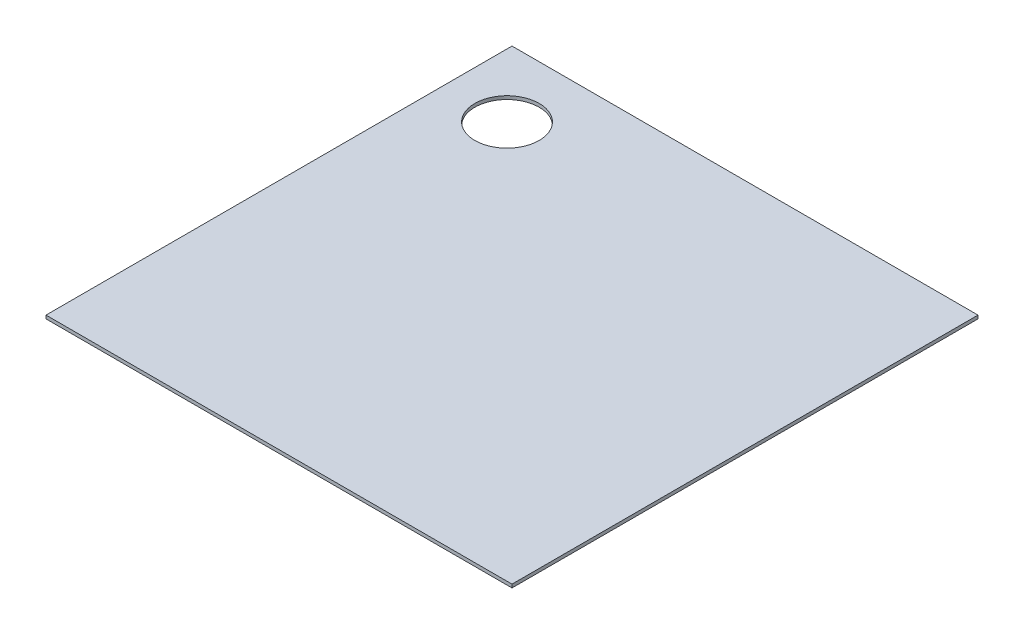
ISO-10303-21;
HEADER;
FILE_DESCRIPTION(('STEP AP214'),'2;1');
FILE_NAME('part.step','',(''),(''),'','','');
FILE_SCHEMA(('AUTOMOTIVE_DESIGN { 1 0 10303 214 1 1 1 1 }'));
ENDSEC;
DATA;
#1=APPLICATION_CONTEXT('core data for automotive mechanical design processes');
#2=APPLICATION_PROTOCOL_DEFINITION('international standard','automotive_design',2000,#1);
#3=PRODUCT_CONTEXT('',#1,'mechanical');
#4=PRODUCT('Part','Part','',(#3));
#5=PRODUCT_RELATED_PRODUCT_CATEGORY('part','',(#4));
#6=PRODUCT_DEFINITION_FORMATION('','',#4);
#7=PRODUCT_DEFINITION_CONTEXT('part definition',#1,'design');
#8=PRODUCT_DEFINITION('design','',#6,#7);
#9=PRODUCT_DEFINITION_SHAPE('','',#8);
#10=(LENGTH_UNIT() NAMED_UNIT(*) SI_UNIT(.MILLI.,.METRE.));
#11=(NAMED_UNIT(*) PLANE_ANGLE_UNIT() SI_UNIT($,.RADIAN.));
#12=(NAMED_UNIT(*) SI_UNIT($,.STERADIAN.) SOLID_ANGLE_UNIT());
#13=UNCERTAINTY_MEASURE_WITH_UNIT(LENGTH_MEASURE(1.E-05),#10,'distance_accuracy_value','');
#14=(GEOMETRIC_REPRESENTATION_CONTEXT(3) GLOBAL_UNCERTAINTY_ASSIGNED_CONTEXT((#13)) GLOBAL_UNIT_ASSIGNED_CONTEXT((#10,
#11,#12)) REPRESENTATION_CONTEXT('',''));
#15=CARTESIAN_POINT('',(0.,0.,0.));
#16=DIRECTION('',(0.,0.,1.));
#17=DIRECTION('',(1.,0.,0.));
#18=AXIS2_PLACEMENT_3D('',#15,#16,#17);
#19=CARTESIAN_POINT('',(0.,0.,0.));
#20=DIRECTION('',(0.,1.,0.));
#21=DIRECTION('',(0.,0.,1.));
#22=AXIS2_PLACEMENT_3D('',#19,#20,#21);
#23=PLANE('',#22);
#24=DIRECTION('',(0.,0.,1.));
#25=VECTOR('',#24,1.);
#26=CARTESIAN_POINT('',(-139.9975,0.,-139.9975));
#27=LINE('',#26,#25);
#28=CARTESIAN_POINT('',(-139.9975,0.,-139.9975));
#29=VERTEX_POINT('',#28);
#30=CARTESIAN_POINT('',(-139.9975,0.,139.9975));
#31=VERTEX_POINT('',#30);
#32=EDGE_CURVE('E20',#29,#31,#27,.T.);
#33=ORIENTED_EDGE('',*,*,#32,.F.);
#34=DIRECTION('',(-1.,0.,0.));
#35=VECTOR('',#34,1.);
#36=CARTESIAN_POINT('',(139.9975,0.,-139.9975));
#37=LINE('',#36,#35);
#38=CARTESIAN_POINT('',(139.9975,0.,-139.9975));
#39=VERTEX_POINT('',#38);
#40=EDGE_CURVE('E79',#39,#29,#37,.T.);
#41=ORIENTED_EDGE('',*,*,#40,.F.);
#42=DIRECTION('',(0.,0.,-1.));
#43=VECTOR('',#42,1.);
#44=CARTESIAN_POINT('',(139.9975,0.,139.9975));
#45=LINE('',#44,#43);
#46=CARTESIAN_POINT('',(139.9975,0.,139.9975));
#47=VERTEX_POINT('',#46);
#48=EDGE_CURVE('E98',#47,#39,#45,.T.);
#49=ORIENTED_EDGE('',*,*,#48,.F.);
#50=DIRECTION('',(1.,0.,0.));
#51=VECTOR('',#50,1.);
#52=CARTESIAN_POINT('',(-139.9975,0.,139.9975));
#53=LINE('',#52,#51);
#54=EDGE_CURVE('E94',#31,#47,#53,.T.);
#55=ORIENTED_EDGE('',*,*,#54,.F.);
#56=EDGE_LOOP('',(#33,#41,#49,#55));
#57=FACE_BOUND('',#56,.T.);
#58=CARTESIAN_POINT('',(-102.,0.,-99.));
#59=DIRECTION('',(0.,1.,0.));
#60=DIRECTION('',(1.,0.,0.));
#61=AXIS2_PLACEMENT_3D('',#58,#59,#60);
#62=CIRCLE('',#61,19.313207915828);
#63=CARTESIAN_POINT('',(-82.686792084172,0.,-99.));
#64=VERTEX_POINT('',#63);
#65=EDGE_CURVE('E86',#64,#64,#62,.T.);
#66=ORIENTED_EDGE('',*,*,#65,.T.);
#67=EDGE_LOOP('',(#66));
#68=FACE_BOUND('',#67,.T.);
#69=ADVANCED_FACE('F17',(#57,#68),#23,.F.);
#70=CARTESIAN_POINT('',(0.,2.,0.));
#71=DIRECTION('',(0.,1.,0.));
#72=DIRECTION('',(0.,0.,1.));
#73=AXIS2_PLACEMENT_3D('',#70,#71,#72);
#74=PLANE('',#73);
#75=DIRECTION('',(0.,0.,1.));
#76=VECTOR('',#75,1.);
#77=CARTESIAN_POINT('',(-139.9975,2.,-139.9975));
#78=LINE('',#77,#76);
#79=CARTESIAN_POINT('',(-139.9975,2.,-139.9975));
#80=VERTEX_POINT('',#79);
#81=CARTESIAN_POINT('',(-139.9975,2.,139.9975));
#82=VERTEX_POINT('',#81);
#83=EDGE_CURVE('E11',#80,#82,#78,.T.);
#84=ORIENTED_EDGE('',*,*,#83,.T.);
#85=DIRECTION('',(1.,0.,0.));
#86=VECTOR('',#85,1.);
#87=CARTESIAN_POINT('',(-139.9975,2.,139.9975));
#88=LINE('',#87,#86);
#89=CARTESIAN_POINT('',(139.9975,2.,139.9975));
#90=VERTEX_POINT('',#89);
#91=EDGE_CURVE('E105',#82,#90,#88,.T.);
#92=ORIENTED_EDGE('',*,*,#91,.T.);
#93=DIRECTION('',(0.,0.,-1.));
#94=VECTOR('',#93,1.);
#95=CARTESIAN_POINT('',(139.9975,2.,139.9975));
#96=LINE('',#95,#94);
#97=CARTESIAN_POINT('',(139.9975,2.,-139.9975));
#98=VERTEX_POINT('',#97);
#99=EDGE_CURVE('E70',#90,#98,#96,.T.);
#100=ORIENTED_EDGE('',*,*,#99,.T.);
#101=DIRECTION('',(-1.,0.,0.));
#102=VECTOR('',#101,1.);
#103=CARTESIAN_POINT('',(139.9975,2.,-139.9975));
#104=LINE('',#103,#102);
#105=EDGE_CURVE('E66',#98,#80,#104,.T.);
#106=ORIENTED_EDGE('',*,*,#105,.T.);
#107=EDGE_LOOP('',(#84,#92,#100,#106));
#108=FACE_BOUND('',#107,.T.);
#109=CARTESIAN_POINT('',(-102.,2.,-99.));
#110=DIRECTION('',(0.,-1.,0.));
#111=DIRECTION('',(1.,0.,0.));
#112=AXIS2_PLACEMENT_3D('',#109,#110,#111);
#113=CIRCLE('',#112,19.313207915828);
#114=CARTESIAN_POINT('',(-121.313207915828,2.,-99.));
#115=VERTEX_POINT('',#114);
#116=EDGE_CURVE('E89',#115,#115,#113,.T.);
#117=ORIENTED_EDGE('',*,*,#116,.T.);
#118=EDGE_LOOP('',(#117));
#119=FACE_BOUND('',#118,.T.);
#120=ADVANCED_FACE('F67',(#108,#119),#74,.T.);
#121=CARTESIAN_POINT('',(-139.9975,0.,-139.9975));
#122=DIRECTION('',(-1.,0.,0.));
#123=DIRECTION('',(0.,0.,1.));
#124=AXIS2_PLACEMENT_3D('',#121,#122,#123);
#125=PLANE('',#124);
#126=ORIENTED_EDGE('',*,*,#32,.T.);
#127=DIRECTION('',(0.,1.,0.));
#128=VECTOR('',#127,1.);
#129=CARTESIAN_POINT('',(-139.9975,0.,139.9975));
#130=LINE('',#129,#128);
#131=EDGE_CURVE('E63',#31,#82,#130,.T.);
#132=ORIENTED_EDGE('',*,*,#131,.T.);
#133=ORIENTED_EDGE('',*,*,#83,.F.);
#134=DIRECTION('',(0.,1.,0.));
#135=VECTOR('',#134,1.);
#136=CARTESIAN_POINT('',(-139.9975,0.,-139.9975));
#137=LINE('',#136,#135);
#138=EDGE_CURVE('E61',#29,#80,#137,.T.);
#139=ORIENTED_EDGE('',*,*,#138,.F.);
#140=EDGE_LOOP('',(#126,#132,#133,#139));
#141=FACE_BOUND('',#140,.T.);
#142=ADVANCED_FACE('F59',(#141),#125,.T.);
#143=CARTESIAN_POINT('',(-139.9975,0.,139.9975));
#144=DIRECTION('',(0.,0.,1.));
#145=DIRECTION('',(1.,0.,0.));
#146=AXIS2_PLACEMENT_3D('',#143,#144,#145);
#147=PLANE('',#146);
#148=ORIENTED_EDGE('',*,*,#54,.T.);
#149=DIRECTION('',(0.,1.,0.));
#150=VECTOR('',#149,1.);
#151=CARTESIAN_POINT('',(139.9975,0.,139.9975));
#152=LINE('',#151,#150);
#153=EDGE_CURVE('E91',#47,#90,#152,.T.);
#154=ORIENTED_EDGE('',*,*,#153,.T.);
#155=ORIENTED_EDGE('',*,*,#91,.F.);
#156=ORIENTED_EDGE('',*,*,#131,.F.);
#157=EDGE_LOOP('',(#148,#154,#155,#156));
#158=FACE_BOUND('',#157,.T.);
#159=ADVANCED_FACE('F142',(#158),#147,.T.);
#160=CARTESIAN_POINT('',(139.9975,0.,139.9975));
#161=DIRECTION('',(1.,0.,0.));
#162=DIRECTION('',(0.,0.,-1.));
#163=AXIS2_PLACEMENT_3D('',#160,#161,#162);
#164=PLANE('',#163);
#165=ORIENTED_EDGE('',*,*,#48,.T.);
#166=DIRECTION('',(0.,1.,0.));
#167=VECTOR('',#166,1.);
#168=CARTESIAN_POINT('',(139.9975,0.,-139.9975));
#169=LINE('',#168,#167);
#170=EDGE_CURVE('E75',#39,#98,#169,.T.);
#171=ORIENTED_EDGE('',*,*,#170,.T.);
#172=ORIENTED_EDGE('',*,*,#99,.F.);
#173=ORIENTED_EDGE('',*,*,#153,.F.);
#174=EDGE_LOOP('',(#165,#171,#172,#173));
#175=FACE_BOUND('',#174,.T.);
#176=ADVANCED_FACE('F132',(#175),#164,.T.);
#177=CARTESIAN_POINT('',(139.9975,0.,-139.9975));
#178=DIRECTION('',(0.,0.,-1.));
#179=DIRECTION('',(-1.,0.,0.));
#180=AXIS2_PLACEMENT_3D('',#177,#178,#179);
#181=PLANE('',#180);
#182=ORIENTED_EDGE('',*,*,#40,.T.);
#183=ORIENTED_EDGE('',*,*,#138,.T.);
#184=ORIENTED_EDGE('',*,*,#105,.F.);
#185=ORIENTED_EDGE('',*,*,#170,.F.);
#186=EDGE_LOOP('',(#182,#183,#184,#185));
#187=FACE_BOUND('',#186,.T.);
#188=ADVANCED_FACE('F77',(#187),#181,.T.);
#189=CARTESIAN_POINT('',(-102.,0.,-99.));
#190=DIRECTION('',(0.,-1.,0.));
#191=DIRECTION('',(1.,0.,0.));
#192=AXIS2_PLACEMENT_3D('',#189,#190,#191);
#193=CYLINDRICAL_SURFACE('',#192,19.313207915828);
#194=ORIENTED_EDGE('',*,*,#65,.F.);
#195=EDGE_LOOP('',(#194));
#196=FACE_BOUND('',#195,.T.);
#197=ORIENTED_EDGE('',*,*,#116,.F.);
#198=EDGE_LOOP('',(#197));
#199=FACE_BOUND('',#198,.T.);
#200=ADVANCED_FACE('F114',(#196,#199),#193,.F.);
#201=CLOSED_SHELL('',(#69,#120,#142,#159,#176,#188,#200));
#202=MANIFOLD_SOLID_BREP('B1',#201);
#203=ADVANCED_BREP_SHAPE_REPRESENTATION('',(#18,#202),#14);
#204=SHAPE_DEFINITION_REPRESENTATION(#9,#203);
ENDSEC;
END-ISO-10303-21;
